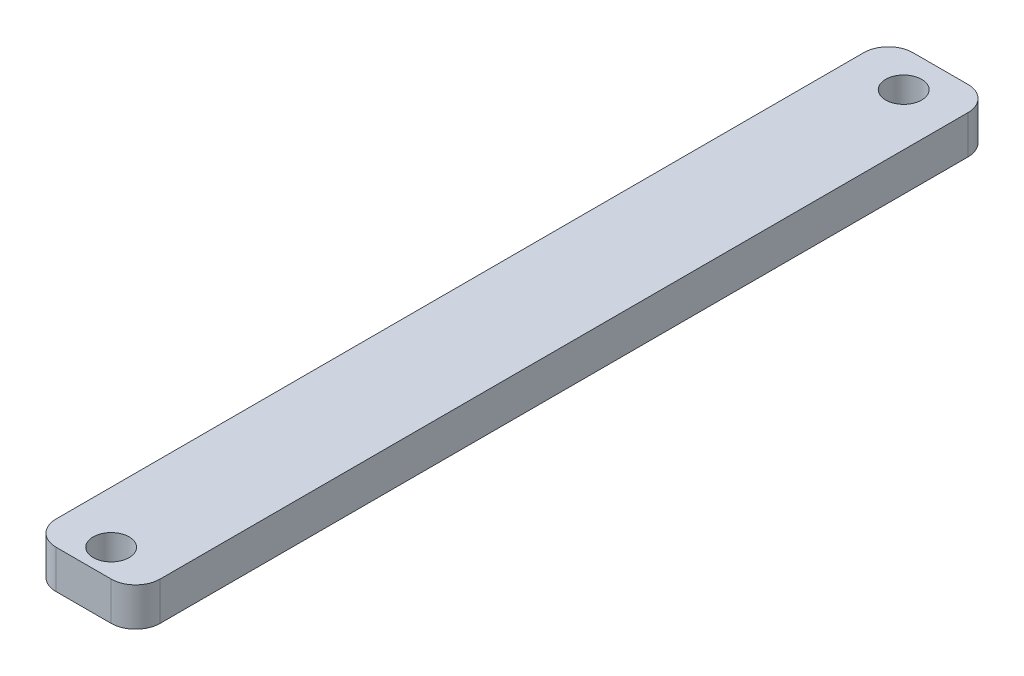
ISO-10303-21;
HEADER;
FILE_DESCRIPTION(('STEP AP214'),'2;1');
FILE_NAME('part.step','',(''),(''),'','','');
FILE_SCHEMA(('AUTOMOTIVE_DESIGN { 1 0 10303 214 1 1 1 1 }'));
ENDSEC;
DATA;
#1=APPLICATION_CONTEXT('core data for automotive mechanical design processes');
#2=APPLICATION_PROTOCOL_DEFINITION('international standard','automotive_design',2000,#1);
#3=PRODUCT_CONTEXT('',#1,'mechanical');
#4=PRODUCT('Part','Part','',(#3));
#5=PRODUCT_RELATED_PRODUCT_CATEGORY('part','',(#4));
#6=PRODUCT_DEFINITION_FORMATION('','',#4);
#7=PRODUCT_DEFINITION_CONTEXT('part definition',#1,'design');
#8=PRODUCT_DEFINITION('design','',#6,#7);
#9=PRODUCT_DEFINITION_SHAPE('','',#8);
#10=(LENGTH_UNIT() NAMED_UNIT(*) SI_UNIT(.MILLI.,.METRE.));
#11=(NAMED_UNIT(*) PLANE_ANGLE_UNIT() SI_UNIT($,.RADIAN.));
#12=(NAMED_UNIT(*) SI_UNIT($,.STERADIAN.) SOLID_ANGLE_UNIT());
#13=UNCERTAINTY_MEASURE_WITH_UNIT(LENGTH_MEASURE(1.E-05),#10,'distance_accuracy_value','');
#14=(GEOMETRIC_REPRESENTATION_CONTEXT(3) GLOBAL_UNCERTAINTY_ASSIGNED_CONTEXT((#13)) GLOBAL_UNIT_ASSIGNED_CONTEXT((#10,
#11,#12)) REPRESENTATION_CONTEXT('',''));
#15=CARTESIAN_POINT('',(0.,0.,0.));
#16=DIRECTION('',(0.,0.,1.));
#17=DIRECTION('',(1.,0.,0.));
#18=AXIS2_PLACEMENT_3D('',#15,#16,#17);
#19=CARTESIAN_POINT('',(-8.49999999999999,3.14,-2.));
#20=DIRECTION('',(0.,0.,1.));
#21=DIRECTION('',(1.,0.,0.));
#22=AXIS2_PLACEMENT_3D('',#19,#20,#21);
#23=PLANE('',#22);
#24=DIRECTION('',(-1.,0.,0.));
#25=VECTOR('',#24,1.);
#26=CARTESIAN_POINT('',(-8.49999999999999,3.14,-2.));
#27=LINE('',#26,#25);
#28=CARTESIAN_POINT('',(-6.,3.14,-2.));
#29=VERTEX_POINT('',#28);
#30=CARTESIAN_POINT('',(-10.5,3.14,-2.));
#31=VERTEX_POINT('',#30);
#32=EDGE_CURVE('E130',#29,#31,#27,.T.);
#33=ORIENTED_EDGE('',*,*,#32,.F.);
#34=DIRECTION('',(0.,-1.,0.));
#35=VECTOR('',#34,1.);
#36=CARTESIAN_POINT('',(-6.,3.14,-2.));
#37=LINE('',#36,#35);
#38=CARTESIAN_POINT('',(-6.,0.,-2.));
#39=VERTEX_POINT('',#38);
#40=EDGE_CURVE('E11',#29,#39,#37,.T.);
#41=ORIENTED_EDGE('',*,*,#40,.T.);
#42=DIRECTION('',(-1.,0.,0.));
#43=VECTOR('',#42,1.);
#44=CARTESIAN_POINT('',(-8.49999999999999,0.,-2.));
#45=LINE('',#44,#43);
#46=CARTESIAN_POINT('',(-10.5,0.,-2.));
#47=VERTEX_POINT('',#46);
#48=EDGE_CURVE('E132',#39,#47,#45,.T.);
#49=ORIENTED_EDGE('',*,*,#48,.T.);
#50=DIRECTION('',(0.,-1.,0.));
#51=VECTOR('',#50,1.);
#52=CARTESIAN_POINT('',(-10.5,3.14,-2.));
#53=LINE('',#52,#51);
#54=EDGE_CURVE('E41',#47,#31,#53,.F.);
#55=ORIENTED_EDGE('',*,*,#54,.T.);
#56=EDGE_LOOP('',(#33,#41,#49,#55));
#57=FACE_BOUND('',#56,.T.);
#58=ADVANCED_FACE('F33',(#57),#23,.F.);
#59=CARTESIAN_POINT('',(-12.5,3.14,-2.));
#60=DIRECTION('',(1.,0.,0.));
#61=DIRECTION('',(0.,0.,-1.));
#62=AXIS2_PLACEMENT_3D('',#59,#60,#61);
#63=PLANE('',#62);
#64=DIRECTION('',(0.,0.,1.));
#65=VECTOR('',#64,1.);
#66=CARTESIAN_POINT('',(-12.5,0.,-2.));
#67=LINE('',#66,#65);
#68=CARTESIAN_POINT('',(-12.5,0.,0.));
#69=VERTEX_POINT('',#68);
#70=CARTESIAN_POINT('',(-12.5,0.,66.));
#71=VERTEX_POINT('',#70);
#72=EDGE_CURVE('E127',#69,#71,#67,.T.);
#73=ORIENTED_EDGE('',*,*,#72,.T.);
#74=DIRECTION('',(0.,-1.,0.));
#75=VECTOR('',#74,1.);
#76=CARTESIAN_POINT('',(-12.5,3.14,66.));
#77=LINE('',#76,#75);
#78=CARTESIAN_POINT('',(-12.5,3.14,66.));
#79=VERTEX_POINT('',#78);
#80=EDGE_CURVE('E104',#71,#79,#77,.F.);
#81=ORIENTED_EDGE('',*,*,#80,.T.);
#82=DIRECTION('',(0.,0.,1.));
#83=VECTOR('',#82,1.);
#84=CARTESIAN_POINT('',(-12.5,3.14,-2.));
#85=LINE('',#84,#83);
#86=CARTESIAN_POINT('',(-12.5,3.14,0.));
#87=VERTEX_POINT('',#86);
#88=EDGE_CURVE('E168',#87,#79,#85,.T.);
#89=ORIENTED_EDGE('',*,*,#88,.F.);
#90=DIRECTION('',(0.,-1.,0.));
#91=VECTOR('',#90,1.);
#92=CARTESIAN_POINT('',(-12.5,3.14,0.));
#93=LINE('',#92,#91);
#94=EDGE_CURVE('E109',#87,#69,#93,.T.);
#95=ORIENTED_EDGE('',*,*,#94,.T.);
#96=EDGE_LOOP('',(#73,#81,#89,#95));
#97=FACE_BOUND('',#96,.T.);
#98=ADVANCED_FACE('F210',(#97),#63,.F.);
#99=CARTESIAN_POINT('',(-3.99999999999999,3.14,68.));
#100=DIRECTION('',(0.,0.,-1.));
#101=DIRECTION('',(-1.,0.,0.));
#102=AXIS2_PLACEMENT_3D('',#99,#100,#101);
#103=PLANE('',#102);
#104=DIRECTION('',(1.,0.,0.));
#105=VECTOR('',#104,1.);
#106=CARTESIAN_POINT('',(-3.99999999999999,3.14,68.));
#107=LINE('',#106,#105);
#108=CARTESIAN_POINT('',(-10.5,3.14,68.));
#109=VERTEX_POINT('',#108);
#110=CARTESIAN_POINT('',(-5.99999999999999,3.14,68.));
#111=VERTEX_POINT('',#110);
#112=EDGE_CURVE('E119',#109,#111,#107,.T.);
#113=ORIENTED_EDGE('',*,*,#112,.F.);
#114=DIRECTION('',(0.,-1.,0.));
#115=VECTOR('',#114,1.);
#116=CARTESIAN_POINT('',(-10.5,3.14,68.));
#117=LINE('',#116,#115);
#118=CARTESIAN_POINT('',(-10.5,0.,68.));
#119=VERTEX_POINT('',#118);
#120=EDGE_CURVE('E103',#109,#119,#117,.T.);
#121=ORIENTED_EDGE('',*,*,#120,.T.);
#122=DIRECTION('',(1.,0.,0.));
#123=VECTOR('',#122,1.);
#124=CARTESIAN_POINT('',(-3.99999999999999,0.,68.));
#125=LINE('',#124,#123);
#126=CARTESIAN_POINT('',(-5.99999999999999,0.,68.));
#127=VERTEX_POINT('',#126);
#128=EDGE_CURVE('E116',#119,#127,#125,.T.);
#129=ORIENTED_EDGE('',*,*,#128,.T.);
#130=DIRECTION('',(0.,-1.,0.));
#131=VECTOR('',#130,1.);
#132=CARTESIAN_POINT('',(-5.99999999999999,3.14,68.));
#133=LINE('',#132,#131);
#134=EDGE_CURVE('E121',#127,#111,#133,.F.);
#135=ORIENTED_EDGE('',*,*,#134,.T.);
#136=EDGE_LOOP('',(#113,#121,#129,#135));
#137=FACE_BOUND('',#136,.T.);
#138=ADVANCED_FACE('F115',(#137),#103,.F.);
#139=CARTESIAN_POINT('',(-4.,3.14,2.));
#140=DIRECTION('',(-1.,0.,0.));
#141=DIRECTION('',(0.,0.,1.));
#142=AXIS2_PLACEMENT_3D('',#139,#140,#141);
#143=PLANE('',#142);
#144=DIRECTION('',(0.,0.,-1.));
#145=VECTOR('',#144,1.);
#146=CARTESIAN_POINT('',(-4.,3.14,2.));
#147=LINE('',#146,#145);
#148=CARTESIAN_POINT('',(-3.99999999999999,3.14,66.));
#149=VERTEX_POINT('',#148);
#150=CARTESIAN_POINT('',(-4.,3.14,0.));
#151=VERTEX_POINT('',#150);
#152=EDGE_CURVE('E136',#149,#151,#147,.T.);
#153=ORIENTED_EDGE('',*,*,#152,.F.);
#154=DIRECTION('',(0.,-1.,0.));
#155=VECTOR('',#154,1.);
#156=CARTESIAN_POINT('',(-3.99999999999999,3.14,66.));
#157=LINE('',#156,#155);
#158=CARTESIAN_POINT('',(-3.99999999999999,0.,66.));
#159=VERTEX_POINT('',#158);
#160=EDGE_CURVE('E154',#149,#159,#157,.T.);
#161=ORIENTED_EDGE('',*,*,#160,.T.);
#162=DIRECTION('',(0.,0.,-1.));
#163=VECTOR('',#162,1.);
#164=CARTESIAN_POINT('',(-4.,0.,2.));
#165=LINE('',#164,#163);
#166=CARTESIAN_POINT('',(-4.,0.,0.));
#167=VERTEX_POINT('',#166);
#168=EDGE_CURVE('E126',#159,#167,#165,.T.);
#169=ORIENTED_EDGE('',*,*,#168,.T.);
#170=DIRECTION('',(0.,-1.,0.));
#171=VECTOR('',#170,1.);
#172=CARTESIAN_POINT('',(-4.,3.14,0.));
#173=LINE('',#172,#171);
#174=EDGE_CURVE('E152',#167,#151,#173,.F.);
#175=ORIENTED_EDGE('',*,*,#174,.T.);
#176=EDGE_LOOP('',(#153,#161,#169,#175));
#177=FACE_BOUND('',#176,.T.);
#178=ADVANCED_FACE('F159',(#177),#143,.F.);
#179=CARTESIAN_POINT('',(0.,3.14,0.));
#180=DIRECTION('',(0.,-1.,0.));
#181=DIRECTION('',(0.,0.,-1.));
#182=AXIS2_PLACEMENT_3D('',#179,#180,#181);
#183=PLANE('',#182);
#184=CARTESIAN_POINT('',(-8.25,3.14,1.));
#185=DIRECTION('',(0.,-1.,0.));
#186=DIRECTION('',(0.,0.,-1.));
#187=AXIS2_PLACEMENT_3D('',#184,#185,#186);
#188=CIRCLE('',#187,1.47);
#189=CARTESIAN_POINT('',(-8.25,3.14,-0.469999999999999));
#190=VERTEX_POINT('',#189);
#191=EDGE_CURVE('E181',#190,#190,#188,.T.);
#192=ORIENTED_EDGE('',*,*,#191,.T.);
#193=EDGE_LOOP('',(#192));
#194=FACE_BOUND('',#193,.T.);
#195=CARTESIAN_POINT('',(-8.25,3.14,65.75));
#196=DIRECTION('',(0.,1.,0.));
#197=DIRECTION('',(0.,0.,1.));
#198=AXIS2_PLACEMENT_3D('',#195,#196,#197);
#199=CIRCLE('',#198,1.46999999999999);
#200=CARTESIAN_POINT('',(-8.25,3.14,67.22));
#201=VERTEX_POINT('',#200);
#202=EDGE_CURVE('E173',#201,#201,#199,.T.);
#203=ORIENTED_EDGE('',*,*,#202,.F.);
#204=EDGE_LOOP('',(#203));
#205=FACE_BOUND('',#204,.T.);
#206=ORIENTED_EDGE('',*,*,#88,.T.);
#207=CARTESIAN_POINT('',(-10.5,3.14,66.));
#208=DIRECTION('',(0.,-1.,0.));
#209=DIRECTION('',(0.,0.,-1.));
#210=AXIS2_PLACEMENT_3D('',#207,#208,#209);
#211=CIRCLE('',#210,2.);
#212=EDGE_CURVE('E150',#79,#109,#211,.F.);
#213=ORIENTED_EDGE('',*,*,#212,.T.);
#214=ORIENTED_EDGE('',*,*,#112,.T.);
#215=CARTESIAN_POINT('',(-5.99999999999999,3.14,66.));
#216=DIRECTION('',(0.,-1.,0.));
#217=DIRECTION('',(0.,0.,-1.));
#218=AXIS2_PLACEMENT_3D('',#215,#216,#217);
#219=CIRCLE('',#218,2.);
#220=EDGE_CURVE('E148',#111,#149,#219,.F.);
#221=ORIENTED_EDGE('',*,*,#220,.T.);
#222=ORIENTED_EDGE('',*,*,#152,.T.);
#223=CARTESIAN_POINT('',(-6.,3.14,0.));
#224=DIRECTION('',(0.,-1.,0.));
#225=DIRECTION('',(0.,0.,-1.));
#226=AXIS2_PLACEMENT_3D('',#223,#224,#225);
#227=CIRCLE('',#226,2.);
#228=EDGE_CURVE('E54',#151,#29,#227,.F.);
#229=ORIENTED_EDGE('',*,*,#228,.T.);
#230=ORIENTED_EDGE('',*,*,#32,.T.);
#231=CARTESIAN_POINT('',(-10.5,3.14,0.));
#232=DIRECTION('',(0.,-1.,0.));
#233=DIRECTION('',(0.,0.,-1.));
#234=AXIS2_PLACEMENT_3D('',#231,#232,#233);
#235=CIRCLE('',#234,2.);
#236=EDGE_CURVE('E145',#31,#87,#235,.F.);
#237=ORIENTED_EDGE('',*,*,#236,.T.);
#238=EDGE_LOOP('',(#206,#213,#214,#221,#222,#229,#230,#237));
#239=FACE_BOUND('',#238,.T.);
#240=ADVANCED_FACE('F189',(#194,#205,#239),#183,.F.);
#241=CARTESIAN_POINT('',(0.,0.,0.));
#242=DIRECTION('',(0.,-1.,0.));
#243=DIRECTION('',(0.,0.,-1.));
#244=AXIS2_PLACEMENT_3D('',#241,#242,#243);
#245=PLANE('',#244);
#246=CARTESIAN_POINT('',(-8.25,0.,1.));
#247=DIRECTION('',(0.,-1.,0.));
#248=DIRECTION('',(0.,0.,-1.));
#249=AXIS2_PLACEMENT_3D('',#246,#247,#248);
#250=CIRCLE('',#249,1.47);
#251=CARTESIAN_POINT('',(-8.25,0.,-0.469999999999999));
#252=VERTEX_POINT('',#251);
#253=EDGE_CURVE('E183',#252,#252,#250,.T.);
#254=ORIENTED_EDGE('',*,*,#253,.F.);
#255=EDGE_LOOP('',(#254));
#256=FACE_BOUND('',#255,.T.);
#257=ORIENTED_EDGE('',*,*,#128,.F.);
#258=CARTESIAN_POINT('',(-10.5,0.,66.));
#259=DIRECTION('',(0.,-1.,0.));
#260=DIRECTION('',(0.,0.,-1.));
#261=AXIS2_PLACEMENT_3D('',#258,#259,#260);
#262=CIRCLE('',#261,2.);
#263=EDGE_CURVE('E99',#119,#71,#262,.T.);
#264=ORIENTED_EDGE('',*,*,#263,.T.);
#265=ORIENTED_EDGE('',*,*,#72,.F.);
#266=CARTESIAN_POINT('',(-10.5,0.,0.));
#267=DIRECTION('',(0.,-1.,0.));
#268=DIRECTION('',(0.,0.,-1.));
#269=AXIS2_PLACEMENT_3D('',#266,#267,#268);
#270=CIRCLE('',#269,2.);
#271=EDGE_CURVE('E120',#69,#47,#270,.T.);
#272=ORIENTED_EDGE('',*,*,#271,.T.);
#273=ORIENTED_EDGE('',*,*,#48,.F.);
#274=CARTESIAN_POINT('',(-6.,0.,0.));
#275=DIRECTION('',(0.,-1.,0.));
#276=DIRECTION('',(0.,0.,-1.));
#277=AXIS2_PLACEMENT_3D('',#274,#275,#276);
#278=CIRCLE('',#277,2.);
#279=EDGE_CURVE('E139',#39,#167,#278,.T.);
#280=ORIENTED_EDGE('',*,*,#279,.T.);
#281=ORIENTED_EDGE('',*,*,#168,.F.);
#282=CARTESIAN_POINT('',(-5.99999999999999,0.,66.));
#283=DIRECTION('',(0.,-1.,0.));
#284=DIRECTION('',(0.,0.,-1.));
#285=AXIS2_PLACEMENT_3D('',#282,#283,#284);
#286=CIRCLE('',#285,2.);
#287=EDGE_CURVE('E110',#159,#127,#286,.T.);
#288=ORIENTED_EDGE('',*,*,#287,.T.);
#289=EDGE_LOOP('',(#257,#264,#265,#272,#273,#280,#281,#288));
#290=FACE_BOUND('',#289,.T.);
#291=CARTESIAN_POINT('',(-8.25,0.,65.75));
#292=DIRECTION('',(0.,1.,0.));
#293=DIRECTION('',(0.,0.,1.));
#294=AXIS2_PLACEMENT_3D('',#291,#292,#293);
#295=CIRCLE('',#294,1.46999999999999);
#296=CARTESIAN_POINT('',(-8.25,0.,67.22));
#297=VERTEX_POINT('',#296);
#298=EDGE_CURVE('E177',#297,#297,#295,.T.);
#299=ORIENTED_EDGE('',*,*,#298,.T.);
#300=EDGE_LOOP('',(#299));
#301=FACE_BOUND('',#300,.T.);
#302=ADVANCED_FACE('F123',(#256,#290,#301),#245,.T.);
#303=CARTESIAN_POINT('',(-8.25,0.,65.75));
#304=DIRECTION('',(0.,1.,0.));
#305=DIRECTION('',(0.,0.,1.));
#306=AXIS2_PLACEMENT_3D('',#303,#304,#305);
#307=CYLINDRICAL_SURFACE('',#306,1.46999999999999);
#308=ORIENTED_EDGE('',*,*,#298,.F.);
#309=EDGE_LOOP('',(#308));
#310=FACE_BOUND('',#309,.T.);
#311=ORIENTED_EDGE('',*,*,#202,.T.);
#312=EDGE_LOOP('',(#311));
#313=FACE_BOUND('',#312,.T.);
#314=ADVANCED_FACE('F199',(#310,#313),#307,.F.);
#315=CARTESIAN_POINT('',(-10.5,3.14,66.));
#316=DIRECTION('',(0.,-1.,0.));
#317=DIRECTION('',(0.,0.,-1.));
#318=AXIS2_PLACEMENT_3D('',#315,#316,#317);
#319=CYLINDRICAL_SURFACE('',#318,2.);
#320=ORIENTED_EDGE('',*,*,#212,.F.);
#321=ORIENTED_EDGE('',*,*,#80,.F.);
#322=ORIENTED_EDGE('',*,*,#263,.F.);
#323=ORIENTED_EDGE('',*,*,#120,.F.);
#324=EDGE_LOOP('',(#320,#321,#322,#323));
#325=FACE_BOUND('',#324,.T.);
#326=ADVANCED_FACE('F102',(#325),#319,.T.);
#327=CARTESIAN_POINT('',(-5.99999999999999,3.14,66.));
#328=DIRECTION('',(0.,-1.,0.));
#329=DIRECTION('',(0.,0.,-1.));
#330=AXIS2_PLACEMENT_3D('',#327,#328,#329);
#331=CYLINDRICAL_SURFACE('',#330,2.);
#332=ORIENTED_EDGE('',*,*,#220,.F.);
#333=ORIENTED_EDGE('',*,*,#134,.F.);
#334=ORIENTED_EDGE('',*,*,#287,.F.);
#335=ORIENTED_EDGE('',*,*,#160,.F.);
#336=EDGE_LOOP('',(#332,#333,#334,#335));
#337=FACE_BOUND('',#336,.T.);
#338=ADVANCED_FACE('F221',(#337),#331,.T.);
#339=CARTESIAN_POINT('',(-6.,3.14,0.));
#340=DIRECTION('',(0.,-1.,0.));
#341=DIRECTION('',(0.,0.,-1.));
#342=AXIS2_PLACEMENT_3D('',#339,#340,#341);
#343=CYLINDRICAL_SURFACE('',#342,2.);
#344=ORIENTED_EDGE('',*,*,#228,.F.);
#345=ORIENTED_EDGE('',*,*,#174,.F.);
#346=ORIENTED_EDGE('',*,*,#279,.F.);
#347=ORIENTED_EDGE('',*,*,#40,.F.);
#348=EDGE_LOOP('',(#344,#345,#346,#347));
#349=FACE_BOUND('',#348,.T.);
#350=ADVANCED_FACE('F166',(#349),#343,.T.);
#351=CARTESIAN_POINT('',(-10.5,3.14,0.));
#352=DIRECTION('',(0.,-1.,0.));
#353=DIRECTION('',(0.,0.,-1.));
#354=AXIS2_PLACEMENT_3D('',#351,#352,#353);
#355=CYLINDRICAL_SURFACE('',#354,2.);
#356=ORIENTED_EDGE('',*,*,#236,.F.);
#357=ORIENTED_EDGE('',*,*,#54,.F.);
#358=ORIENTED_EDGE('',*,*,#271,.F.);
#359=ORIENTED_EDGE('',*,*,#94,.F.);
#360=EDGE_LOOP('',(#356,#357,#358,#359));
#361=FACE_BOUND('',#360,.T.);
#362=ADVANCED_FACE('F35',(#361),#355,.T.);
#363=CARTESIAN_POINT('',(-8.25,3.14,1.));
#364=DIRECTION('',(0.,-1.,0.));
#365=DIRECTION('',(0.,0.,-1.));
#366=AXIS2_PLACEMENT_3D('',#363,#364,#365);
#367=CYLINDRICAL_SURFACE('',#366,1.47);
#368=ORIENTED_EDGE('',*,*,#191,.F.);
#369=EDGE_LOOP('',(#368));
#370=FACE_BOUND('',#369,.T.);
#371=ORIENTED_EDGE('',*,*,#253,.T.);
#372=EDGE_LOOP('',(#371));
#373=FACE_BOUND('',#372,.T.);
#374=ADVANCED_FACE('F192',(#370,#373),#367,.F.);
#375=CLOSED_SHELL('',(#58,#98,#138,#178,#240,#302,#314,#326,#338,#350,#362,#374));
#376=MANIFOLD_SOLID_BREP('B2',#375);
#377=ADVANCED_BREP_SHAPE_REPRESENTATION('',(#18,#376),#14);
#378=SHAPE_DEFINITION_REPRESENTATION(#9,#377);
ENDSEC;
END-ISO-10303-21;
